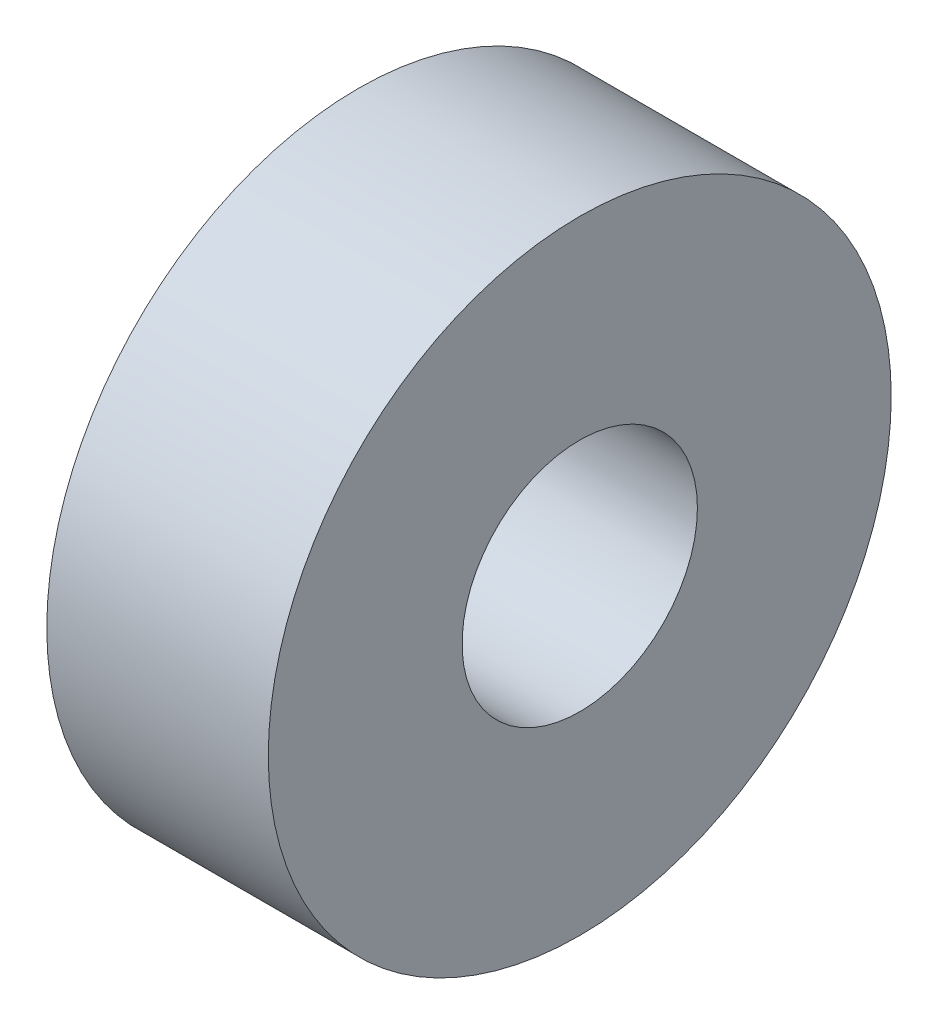
ISO-10303-21;
HEADER;
FILE_DESCRIPTION(('STEP AP214'),'2;1');
FILE_NAME('part.step','',(''),(''),'','','');
FILE_SCHEMA(('AUTOMOTIVE_DESIGN { 1 0 10303 214 1 1 1 1 }'));
ENDSEC;
DATA;
#1=APPLICATION_CONTEXT('core data for automotive mechanical design processes');
#2=APPLICATION_PROTOCOL_DEFINITION('international standard','automotive_design',2000,#1);
#3=PRODUCT_CONTEXT('',#1,'mechanical');
#4=PRODUCT('Part','Part','',(#3));
#5=PRODUCT_RELATED_PRODUCT_CATEGORY('part','',(#4));
#6=PRODUCT_DEFINITION_FORMATION('','',#4);
#7=PRODUCT_DEFINITION_CONTEXT('part definition',#1,'design');
#8=PRODUCT_DEFINITION('design','',#6,#7);
#9=PRODUCT_DEFINITION_SHAPE('','',#8);
#10=(LENGTH_UNIT() NAMED_UNIT(*) SI_UNIT(.MILLI.,.METRE.));
#11=(NAMED_UNIT(*) PLANE_ANGLE_UNIT() SI_UNIT($,.RADIAN.));
#12=(NAMED_UNIT(*) SI_UNIT($,.STERADIAN.) SOLID_ANGLE_UNIT());
#13=UNCERTAINTY_MEASURE_WITH_UNIT(LENGTH_MEASURE(1.E-05),#10,'distance_accuracy_value','');
#14=(GEOMETRIC_REPRESENTATION_CONTEXT(3) GLOBAL_UNCERTAINTY_ASSIGNED_CONTEXT((#13)) GLOBAL_UNIT_ASSIGNED_CONTEXT((#10,
#11,#12)) REPRESENTATION_CONTEXT('',''));
#15=CARTESIAN_POINT('',(0.,0.,0.));
#16=DIRECTION('',(0.,0.,1.));
#17=DIRECTION('',(1.,0.,0.));
#18=AXIS2_PLACEMENT_3D('',#15,#16,#17);
#19=CARTESIAN_POINT('',(4.,0.,0.));
#20=DIRECTION('',(1.,0.,0.));
#21=DIRECTION('',(0.,0.,-1.));
#22=AXIS2_PLACEMENT_3D('',#19,#20,#21);
#23=PLANE('',#22);
#24=CARTESIAN_POINT('',(4.,0.,0.));
#25=DIRECTION('',(1.,0.,0.));
#26=DIRECTION('',(0.,0.,-1.));
#27=AXIS2_PLACEMENT_3D('',#24,#25,#26);
#28=CIRCLE('',#27,11.25);
#29=CARTESIAN_POINT('',(4.,0.,-11.25));
#30=VERTEX_POINT('',#29);
#31=EDGE_CURVE('E10',#30,#30,#28,.T.);
#32=ORIENTED_EDGE('',*,*,#31,.T.);
#33=EDGE_LOOP('',(#32));
#34=FACE_BOUND('',#33,.T.);
#35=CARTESIAN_POINT('',(4.,0.,0.));
#36=DIRECTION('',(1.,0.,0.));
#37=DIRECTION('',(0.,0.,-1.));
#38=AXIS2_PLACEMENT_3D('',#35,#36,#37);
#39=CIRCLE('',#38,4.25);
#40=CARTESIAN_POINT('',(4.,0.,-4.25));
#41=VERTEX_POINT('',#40);
#42=EDGE_CURVE('E49',#41,#41,#39,.T.);
#43=ORIENTED_EDGE('',*,*,#42,.F.);
#44=EDGE_LOOP('',(#43));
#45=FACE_BOUND('',#44,.T.);
#46=ADVANCED_FACE('F38',(#34,#45),#23,.T.);
#47=CARTESIAN_POINT('',(-4.,0.,0.));
#48=DIRECTION('',(1.,0.,0.));
#49=DIRECTION('',(0.,0.,-1.));
#50=AXIS2_PLACEMENT_3D('',#47,#48,#49);
#51=PLANE('',#50);
#52=CARTESIAN_POINT('',(-4.,0.,0.));
#53=DIRECTION('',(1.,0.,0.));
#54=DIRECTION('',(0.,0.,-1.));
#55=AXIS2_PLACEMENT_3D('',#52,#53,#54);
#56=CIRCLE('',#55,11.25);
#57=CARTESIAN_POINT('',(-4.,0.,-11.25));
#58=VERTEX_POINT('',#57);
#59=EDGE_CURVE('E42',#58,#58,#56,.T.);
#60=ORIENTED_EDGE('',*,*,#59,.F.);
#61=EDGE_LOOP('',(#60));
#62=FACE_BOUND('',#61,.T.);
#63=CARTESIAN_POINT('',(-4.,0.,0.));
#64=DIRECTION('',(1.,0.,0.));
#65=DIRECTION('',(0.,0.,-1.));
#66=AXIS2_PLACEMENT_3D('',#63,#64,#65);
#67=CIRCLE('',#66,4.25);
#68=CARTESIAN_POINT('',(-4.,0.,-4.25));
#69=VERTEX_POINT('',#68);
#70=EDGE_CURVE('E51',#69,#69,#67,.T.);
#71=ORIENTED_EDGE('',*,*,#70,.T.);
#72=EDGE_LOOP('',(#71));
#73=FACE_BOUND('',#72,.T.);
#74=ADVANCED_FACE('F61',(#62,#73),#51,.F.);
#75=CARTESIAN_POINT('',(4.,0.,0.));
#76=DIRECTION('',(-1.,0.,0.));
#77=DIRECTION('',(0.,0.,1.));
#78=AXIS2_PLACEMENT_3D('',#75,#76,#77);
#79=CYLINDRICAL_SURFACE('',#78,11.25);
#80=ORIENTED_EDGE('',*,*,#31,.F.);
#81=EDGE_LOOP('',(#80));
#82=FACE_BOUND('',#81,.T.);
#83=ORIENTED_EDGE('',*,*,#59,.T.);
#84=EDGE_LOOP('',(#83));
#85=FACE_BOUND('',#84,.T.);
#86=ADVANCED_FACE('F40',(#82,#85),#79,.T.);
#87=CARTESIAN_POINT('',(4.,0.,0.));
#88=DIRECTION('',(-1.,0.,0.));
#89=DIRECTION('',(0.,0.,1.));
#90=AXIS2_PLACEMENT_3D('',#87,#88,#89);
#91=CYLINDRICAL_SURFACE('',#90,4.25);
#92=ORIENTED_EDGE('',*,*,#42,.T.);
#93=EDGE_LOOP('',(#92));
#94=FACE_BOUND('',#93,.T.);
#95=ORIENTED_EDGE('',*,*,#70,.F.);
#96=EDGE_LOOP('',(#95));
#97=FACE_BOUND('',#96,.T.);
#98=ADVANCED_FACE('F57',(#94,#97),#91,.F.);
#99=CLOSED_SHELL('',(#46,#74,#86,#98));
#100=MANIFOLD_SOLID_BREP('B2',#99);
#101=ADVANCED_BREP_SHAPE_REPRESENTATION('',(#18,#100),#14);
#102=SHAPE_DEFINITION_REPRESENTATION(#9,#101);
ENDSEC;
END-ISO-10303-21;
